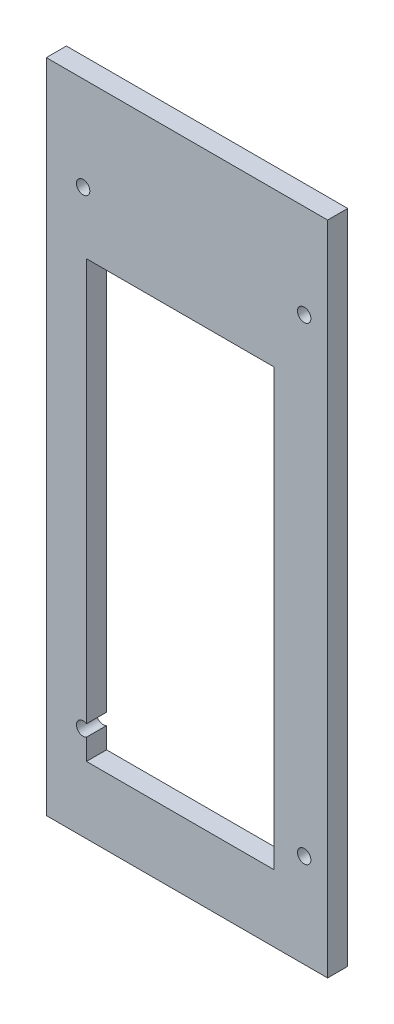
ISO-10303-21;
HEADER;
FILE_DESCRIPTION(('STEP AP214'),'2;1');
FILE_NAME('part.step','',(''),(''),'','','');
FILE_SCHEMA(('AUTOMOTIVE_DESIGN { 1 0 10303 214 1 1 1 1 }'));
ENDSEC;
DATA;
#1=APPLICATION_CONTEXT('core data for automotive mechanical design processes');
#2=APPLICATION_PROTOCOL_DEFINITION('international standard','automotive_design',2000,#1);
#3=PRODUCT_CONTEXT('',#1,'mechanical');
#4=PRODUCT('Part','Part','',(#3));
#5=PRODUCT_RELATED_PRODUCT_CATEGORY('part','',(#4));
#6=PRODUCT_DEFINITION_FORMATION('','',#4);
#7=PRODUCT_DEFINITION_CONTEXT('part definition',#1,'design');
#8=PRODUCT_DEFINITION('design','',#6,#7);
#9=PRODUCT_DEFINITION_SHAPE('','',#8);
#10=(LENGTH_UNIT() NAMED_UNIT(*) SI_UNIT(.MILLI.,.METRE.));
#11=(NAMED_UNIT(*) PLANE_ANGLE_UNIT() SI_UNIT($,.RADIAN.));
#12=(NAMED_UNIT(*) SI_UNIT($,.STERADIAN.) SOLID_ANGLE_UNIT());
#13=UNCERTAINTY_MEASURE_WITH_UNIT(LENGTH_MEASURE(1.E-05),#10,'distance_accuracy_value','');
#14=(GEOMETRIC_REPRESENTATION_CONTEXT(3) GLOBAL_UNCERTAINTY_ASSIGNED_CONTEXT((#13)) GLOBAL_UNIT_ASSIGNED_CONTEXT((#10,
#11,#12)) REPRESENTATION_CONTEXT('',''));
#15=CARTESIAN_POINT('',(0.,0.,0.));
#16=DIRECTION('',(0.,0.,1.));
#17=DIRECTION('',(1.,0.,0.));
#18=AXIS2_PLACEMENT_3D('',#15,#16,#17);
#19=CARTESIAN_POINT('',(6.,0.,3.));
#20=DIRECTION('',(1.,0.,0.));
#21=DIRECTION('',(0.,1.,0.));
#22=AXIS2_PLACEMENT_3D('',#19,#20,#21);
#23=PLANE('',#22);
#24=DIRECTION('',(0.,0.,-1.));
#25=VECTOR('',#24,1.);
#26=CARTESIAN_POINT('',(6.00000000000001,-92.86909632108,5.82842712474619));
#27=LINE('',#26,#25);
#28=CARTESIAN_POINT('',(6.00000000000002,-92.86909632108,3.));
#29=VERTEX_POINT('',#28);
#30=CARTESIAN_POINT('',(6.00000000000001,-92.86909632108,0.));
#31=VERTEX_POINT('',#30);
#32=EDGE_CURVE('E60',#29,#31,#27,.T.);
#33=ORIENTED_EDGE('',*,*,#32,.F.);
#34=DIRECTION('',(0.,-1.,0.));
#35=VECTOR('',#34,1.);
#36=CARTESIAN_POINT('',(6.,0.,3.));
#37=LINE('',#36,#35);
#38=CARTESIAN_POINT('',(6.00000000000001,-96.0030709172956,3.));
#39=VERTEX_POINT('',#38);
#40=EDGE_CURVE('E137',#29,#39,#37,.T.);
#41=ORIENTED_EDGE('',*,*,#40,.T.);
#42=DIRECTION('',(0.,0.,-1.));
#43=VECTOR('',#42,1.);
#44=CARTESIAN_POINT('',(6.00000000000001,-96.0030709172956,3.));
#45=LINE('',#44,#43);
#46=CARTESIAN_POINT('',(6.00000000000001,-96.0030709172956,0.));
#47=VERTEX_POINT('',#46);
#48=EDGE_CURVE('E45',#39,#47,#45,.T.);
#49=ORIENTED_EDGE('',*,*,#48,.T.);
#50=DIRECTION('',(0.,-1.,0.));
#51=VECTOR('',#50,1.);
#52=CARTESIAN_POINT('',(6.,0.,0.));
#53=LINE('',#52,#51);
#54=EDGE_CURVE('E162',#31,#47,#53,.T.);
#55=ORIENTED_EDGE('',*,*,#54,.F.);
#56=EDGE_LOOP('',(#33,#41,#49,#55));
#57=FACE_BOUND('',#56,.T.);
#58=ADVANCED_FACE('F37',(#57),#23,.T.);
#59=CARTESIAN_POINT('',(0.,-31.0030709172956,3.));
#60=DIRECTION('',(0.,-1.,0.));
#61=DIRECTION('',(0.,0.,-1.));
#62=AXIS2_PLACEMENT_3D('',#59,#60,#61);
#63=PLANE('',#62);
#64=DIRECTION('',(0.,0.,1.));
#65=VECTOR('',#64,1.);
#66=CARTESIAN_POINT('',(34.,-31.0030709172956,-65.0307619515564));
#67=LINE('',#66,#65);
#68=CARTESIAN_POINT('',(34.,-31.0030709172956,0.));
#69=VERTEX_POINT('',#68);
#70=CARTESIAN_POINT('',(34.,-31.0030709172956,3.));
#71=VERTEX_POINT('',#70);
#72=EDGE_CURVE('E52',#69,#71,#67,.T.);
#73=ORIENTED_EDGE('',*,*,#72,.T.);
#74=DIRECTION('',(-1.,0.,0.));
#75=VECTOR('',#74,1.);
#76=CARTESIAN_POINT('',(0.,-31.0030709172956,3.));
#77=LINE('',#76,#75);
#78=CARTESIAN_POINT('',(6.,-31.0030709172956,3.));
#79=VERTEX_POINT('',#78);
#80=EDGE_CURVE('E124',#71,#79,#77,.T.);
#81=ORIENTED_EDGE('',*,*,#80,.T.);
#82=DIRECTION('',(0.,0.,-1.));
#83=VECTOR('',#82,1.);
#84=CARTESIAN_POINT('',(6.,-31.0030709172956,3.));
#85=LINE('',#84,#83);
#86=CARTESIAN_POINT('',(6.,-31.0030709172956,0.));
#87=VERTEX_POINT('',#86);
#88=EDGE_CURVE('E167',#79,#87,#85,.T.);
#89=ORIENTED_EDGE('',*,*,#88,.T.);
#90=DIRECTION('',(-1.,0.,0.));
#91=VECTOR('',#90,1.);
#92=CARTESIAN_POINT('',(0.,-31.0030709172956,0.));
#93=LINE('',#92,#91);
#94=EDGE_CURVE('E126',#69,#87,#93,.T.);
#95=ORIENTED_EDGE('',*,*,#94,.F.);
#96=EDGE_LOOP('',(#73,#81,#89,#95));
#97=FACE_BOUND('',#96,.T.);
#98=ADVANCED_FACE('F122',(#97),#63,.T.);
#99=CARTESIAN_POINT('',(0.,-96.0030709172956,3.));
#100=DIRECTION('',(0.,1.,0.));
#101=DIRECTION('',(-1.,0.,0.));
#102=AXIS2_PLACEMENT_3D('',#99,#100,#101);
#103=PLANE('',#102);
#104=DIRECTION('',(0.,0.,1.));
#105=VECTOR('',#104,1.);
#106=CARTESIAN_POINT('',(34.,-96.0030709172956,-65.0307619515564));
#107=LINE('',#106,#105);
#108=CARTESIAN_POINT('',(34.,-96.0030709172956,0.));
#109=VERTEX_POINT('',#108);
#110=CARTESIAN_POINT('',(34.,-96.0030709172956,3.));
#111=VERTEX_POINT('',#110);
#112=EDGE_CURVE('E114',#109,#111,#107,.T.);
#113=ORIENTED_EDGE('',*,*,#112,.F.);
#114=DIRECTION('',(1.,0.,0.));
#115=VECTOR('',#114,1.);
#116=CARTESIAN_POINT('',(0.,-96.0030709172956,0.));
#117=LINE('',#116,#115);
#118=EDGE_CURVE('E159',#47,#109,#117,.T.);
#119=ORIENTED_EDGE('',*,*,#118,.F.);
#120=ORIENTED_EDGE('',*,*,#48,.F.);
#121=DIRECTION('',(1.,0.,0.));
#122=VECTOR('',#121,1.);
#123=CARTESIAN_POINT('',(0.,-96.0030709172956,3.));
#124=LINE('',#123,#122);
#125=EDGE_CURVE('E134',#39,#111,#124,.T.);
#126=ORIENTED_EDGE('',*,*,#125,.T.);
#127=EDGE_LOOP('',(#113,#119,#120,#126));
#128=FACE_BOUND('',#127,.T.);
#129=ADVANCED_FACE('F230',(#128),#103,.T.);
#130=CARTESIAN_POINT('',(0.,-8.00307091729556,3.));
#131=DIRECTION('',(0.,1.,0.));
#132=DIRECTION('',(0.,0.,1.));
#133=AXIS2_PLACEMENT_3D('',#130,#131,#132);
#134=PLANE('',#133);
#135=DIRECTION('',(1.,0.,0.));
#136=VECTOR('',#135,1.);
#137=CARTESIAN_POINT('',(0.,-8.00307091729556,0.));
#138=LINE('',#137,#136);
#139=CARTESIAN_POINT('',(0.,-8.00307091729555,0.));
#140=VERTEX_POINT('',#139);
#141=CARTESIAN_POINT('',(42.,-8.00307091729555,0.));
#142=VERTEX_POINT('',#141);
#143=EDGE_CURVE('E146',#140,#142,#138,.T.);
#144=ORIENTED_EDGE('',*,*,#143,.F.);
#145=DIRECTION('',(0.,0.,-1.));
#146=VECTOR('',#145,1.);
#147=CARTESIAN_POINT('',(0.,-8.00307091729555,3.));
#148=LINE('',#147,#146);
#149=CARTESIAN_POINT('',(0.,-8.00307091729555,3.));
#150=VERTEX_POINT('',#149);
#151=EDGE_CURVE('E169',#150,#140,#148,.T.);
#152=ORIENTED_EDGE('',*,*,#151,.F.);
#153=DIRECTION('',(1.,0.,0.));
#154=VECTOR('',#153,1.);
#155=CARTESIAN_POINT('',(0.,-8.00307091729556,3.));
#156=LINE('',#155,#154);
#157=CARTESIAN_POINT('',(42.,-8.00307091729555,3.));
#158=VERTEX_POINT('',#157);
#159=EDGE_CURVE('E166',#150,#158,#156,.T.);
#160=ORIENTED_EDGE('',*,*,#159,.T.);
#161=DIRECTION('',(0.,0.,-1.));
#162=VECTOR('',#161,1.);
#163=CARTESIAN_POINT('',(42.,-8.00307091729555,3.));
#164=LINE('',#163,#162);
#165=EDGE_CURVE('E145',#158,#142,#164,.T.);
#166=ORIENTED_EDGE('',*,*,#165,.T.);
#167=EDGE_LOOP('',(#144,#152,#160,#166));
#168=FACE_BOUND('',#167,.T.);
#169=ADVANCED_FACE('F39',(#168),#134,.T.);
#170=CARTESIAN_POINT('',(0.,0.,3.));
#171=DIRECTION('',(1.,0.,0.));
#172=DIRECTION('',(0.,0.,-1.));
#173=AXIS2_PLACEMENT_3D('',#170,#171,#172);
#174=PLANE('',#173);
#175=DIRECTION('',(0.,-1.,0.));
#176=VECTOR('',#175,1.);
#177=CARTESIAN_POINT('',(0.,0.,0.));
#178=LINE('',#177,#176);
#179=CARTESIAN_POINT('',(0.,-106.003070917296,0.));
#180=VERTEX_POINT('',#179);
#181=EDGE_CURVE('E149',#140,#180,#178,.T.);
#182=ORIENTED_EDGE('',*,*,#181,.T.);
#183=DIRECTION('',(0.,0.,-1.));
#184=VECTOR('',#183,1.);
#185=CARTESIAN_POINT('',(0.,-106.003070917296,3.));
#186=LINE('',#185,#184);
#187=CARTESIAN_POINT('',(0.,-106.003070917296,3.));
#188=VERTEX_POINT('',#187);
#189=EDGE_CURVE('E175',#188,#180,#186,.T.);
#190=ORIENTED_EDGE('',*,*,#189,.F.);
#191=DIRECTION('',(0.,-1.,0.));
#192=VECTOR('',#191,1.);
#193=CARTESIAN_POINT('',(0.,0.,3.));
#194=LINE('',#193,#192);
#195=EDGE_CURVE('E181',#150,#188,#194,.T.);
#196=ORIENTED_EDGE('',*,*,#195,.F.);
#197=ORIENTED_EDGE('',*,*,#151,.T.);
#198=EDGE_LOOP('',(#182,#190,#196,#197));
#199=FACE_BOUND('',#198,.T.);
#200=ADVANCED_FACE('F179',(#199),#174,.F.);
#201=CARTESIAN_POINT('',(0.,-106.003070917296,3.));
#202=DIRECTION('',(0.,-1.,0.));
#203=DIRECTION('',(0.,0.,-1.));
#204=AXIS2_PLACEMENT_3D('',#201,#202,#203);
#205=PLANE('',#204);
#206=DIRECTION('',(-1.,0.,0.));
#207=VECTOR('',#206,1.);
#208=CARTESIAN_POINT('',(0.,-106.003070917296,0.));
#209=LINE('',#208,#207);
#210=CARTESIAN_POINT('',(42.,-106.003070917296,0.));
#211=VERTEX_POINT('',#210);
#212=EDGE_CURVE('E152',#211,#180,#209,.T.);
#213=ORIENTED_EDGE('',*,*,#212,.F.);
#214=DIRECTION('',(0.,0.,-1.));
#215=VECTOR('',#214,1.);
#216=CARTESIAN_POINT('',(42.,-106.003070917296,3.));
#217=LINE('',#216,#215);
#218=CARTESIAN_POINT('',(42.,-106.003070917296,3.));
#219=VERTEX_POINT('',#218);
#220=EDGE_CURVE('E173',#219,#211,#217,.T.);
#221=ORIENTED_EDGE('',*,*,#220,.F.);
#222=DIRECTION('',(-1.,0.,0.));
#223=VECTOR('',#222,1.);
#224=CARTESIAN_POINT('',(0.,-106.003070917296,3.));
#225=LINE('',#224,#223);
#226=EDGE_CURVE('E140',#219,#188,#225,.T.);
#227=ORIENTED_EDGE('',*,*,#226,.T.);
#228=ORIENTED_EDGE('',*,*,#189,.T.);
#229=EDGE_LOOP('',(#213,#221,#227,#228));
#230=FACE_BOUND('',#229,.T.);
#231=ADVANCED_FACE('F196',(#230),#205,.T.);
#232=CARTESIAN_POINT('',(42.,0.,3.));
#233=DIRECTION('',(1.,0.,0.));
#234=DIRECTION('',(0.,0.,-1.));
#235=AXIS2_PLACEMENT_3D('',#232,#233,#234);
#236=PLANE('',#235);
#237=DIRECTION('',(0.,-1.,0.));
#238=VECTOR('',#237,1.);
#239=CARTESIAN_POINT('',(42.,0.,0.));
#240=LINE('',#239,#238);
#241=EDGE_CURVE('E155',#142,#211,#240,.T.);
#242=ORIENTED_EDGE('',*,*,#241,.F.);
#243=ORIENTED_EDGE('',*,*,#165,.F.);
#244=DIRECTION('',(0.,-1.,0.));
#245=VECTOR('',#244,1.);
#246=CARTESIAN_POINT('',(42.,0.,3.));
#247=LINE('',#246,#245);
#248=EDGE_CURVE('E135',#158,#219,#247,.T.);
#249=ORIENTED_EDGE('',*,*,#248,.T.);
#250=ORIENTED_EDGE('',*,*,#220,.T.);
#251=EDGE_LOOP('',(#242,#243,#249,#250));
#252=FACE_BOUND('',#251,.T.);
#253=ADVANCED_FACE('F192',(#252),#236,.T.);
#254=DIRECTION('',(0.,0.,-1.));
#255=VECTOR('',#254,1.);
#256=CARTESIAN_POINT('',(6.00000000000001,-91.1370455135111,5.82842712474619));
#257=LINE('',#256,#255);
#258=CARTESIAN_POINT('',(6.00000000000002,-91.1370455135111,0.));
#259=VERTEX_POINT('',#258);
#260=CARTESIAN_POINT('',(6.00000000000002,-91.1370455135111,3.));
#261=VERTEX_POINT('',#260);
#262=EDGE_CURVE('E202',#259,#261,#257,.F.);
#263=ORIENTED_EDGE('',*,*,#262,.F.);
#264=EDGE_CURVE('E163',#87,#259,#53,.T.);
#265=ORIENTED_EDGE('',*,*,#264,.F.);
#266=ORIENTED_EDGE('',*,*,#88,.F.);
#267=EDGE_CURVE('E133',#79,#261,#37,.T.);
#268=ORIENTED_EDGE('',*,*,#267,.T.);
#269=EDGE_LOOP('',(#263,#265,#266,#268));
#270=FACE_BOUND('',#269,.T.);
#271=ADVANCED_FACE('F239',(#270),#23,.T.);
#272=CARTESIAN_POINT('',(0.,0.,3.));
#273=DIRECTION('',(0.,0.,1.));
#274=DIRECTION('',(1.,0.,0.));
#275=AXIS2_PLACEMENT_3D('',#272,#273,#274);
#276=PLANE('',#275);
#277=CARTESIAN_POINT('',(38.5,-92.0030709172956,3.));
#278=DIRECTION('',(0.,0.,1.));
#279=DIRECTION('',(1.,0.,0.));
#280=AXIS2_PLACEMENT_3D('',#277,#278,#279);
#281=CIRCLE('',#280,0.999999999999998);
#282=CARTESIAN_POINT('',(37.5,-92.0030709172956,3.));
#283=VERTEX_POINT('',#282);
#284=EDGE_CURVE('E211',#283,#283,#281,.F.);
#285=ORIENTED_EDGE('',*,*,#284,.T.);
#286=EDGE_LOOP('',(#285));
#287=FACE_BOUND('',#286,.T.);
#288=CARTESIAN_POINT('',(5.50000000000003,-92.0030709172955,3.));
#289=DIRECTION('',(0.,0.,1.));
#290=DIRECTION('',(1.,0.,0.));
#291=AXIS2_PLACEMENT_3D('',#288,#289,#290);
#292=CIRCLE('',#291,1.);
#293=EDGE_CURVE('E214',#29,#261,#292,.F.);
#294=ORIENTED_EDGE('',*,*,#293,.T.);
#295=ORIENTED_EDGE('',*,*,#267,.F.);
#296=ORIENTED_EDGE('',*,*,#80,.F.);
#297=DIRECTION('',(0.,-1.,0.));
#298=VECTOR('',#297,1.);
#299=CARTESIAN_POINT('',(34.,-31.0030709172956,3.));
#300=LINE('',#299,#298);
#301=EDGE_CURVE('E111',#71,#111,#300,.T.);
#302=ORIENTED_EDGE('',*,*,#301,.T.);
#303=ORIENTED_EDGE('',*,*,#125,.F.);
#304=ORIENTED_EDGE('',*,*,#40,.F.);
#305=EDGE_LOOP('',(#294,#295,#296,#302,#303,#304));
#306=FACE_BOUND('',#305,.T.);
#307=CARTESIAN_POINT('',(5.50000000000003,-22.0030709172956,3.));
#308=DIRECTION('',(0.,0.,1.));
#309=DIRECTION('',(1.,0.,0.));
#310=AXIS2_PLACEMENT_3D('',#307,#308,#309);
#311=CIRCLE('',#310,1.);
#312=CARTESIAN_POINT('',(4.50000000000002,-22.0030709172956,3.));
#313=VERTEX_POINT('',#312);
#314=EDGE_CURVE('E210',#313,#313,#311,.F.);
#315=ORIENTED_EDGE('',*,*,#314,.T.);
#316=EDGE_LOOP('',(#315));
#317=FACE_BOUND('',#316,.T.);
#318=CARTESIAN_POINT('',(38.5,-22.0030709172956,3.));
#319=DIRECTION('',(0.,0.,1.));
#320=DIRECTION('',(1.,0.,0.));
#321=AXIS2_PLACEMENT_3D('',#318,#319,#320);
#322=CIRCLE('',#321,0.999999999999998);
#323=CARTESIAN_POINT('',(37.5,-22.0030709172956,3.));
#324=VERTEX_POINT('',#323);
#325=EDGE_CURVE('E204',#324,#324,#322,.F.);
#326=ORIENTED_EDGE('',*,*,#325,.T.);
#327=EDGE_LOOP('',(#326));
#328=FACE_BOUND('',#327,.T.);
#329=ORIENTED_EDGE('',*,*,#159,.F.);
#330=ORIENTED_EDGE('',*,*,#195,.T.);
#331=ORIENTED_EDGE('',*,*,#226,.F.);
#332=ORIENTED_EDGE('',*,*,#248,.F.);
#333=EDGE_LOOP('',(#329,#330,#331,#332));
#334=FACE_BOUND('',#333,.T.);
#335=ADVANCED_FACE('F130',(#287,#306,#317,#328,#334),#276,.T.);
#336=CARTESIAN_POINT('',(0.,0.,0.));
#337=DIRECTION('',(0.,0.,1.));
#338=DIRECTION('',(1.,0.,0.));
#339=AXIS2_PLACEMENT_3D('',#336,#337,#338);
#340=PLANE('',#339);
#341=ORIENTED_EDGE('',*,*,#118,.T.);
#342=DIRECTION('',(0.,1.,0.));
#343=VECTOR('',#342,1.);
#344=CARTESIAN_POINT('',(34.,-31.0030709172956,0.));
#345=LINE('',#344,#343);
#346=EDGE_CURVE('E218',#109,#69,#345,.T.);
#347=ORIENTED_EDGE('',*,*,#346,.T.);
#348=ORIENTED_EDGE('',*,*,#94,.T.);
#349=ORIENTED_EDGE('',*,*,#264,.T.);
#350=CARTESIAN_POINT('',(5.50000000000003,-92.0030709172955,0.));
#351=DIRECTION('',(0.,0.,1.));
#352=DIRECTION('',(1.,0.,0.));
#353=AXIS2_PLACEMENT_3D('',#350,#351,#352);
#354=CIRCLE('',#353,1.);
#355=EDGE_CURVE('E11',#259,#31,#354,.T.);
#356=ORIENTED_EDGE('',*,*,#355,.T.);
#357=ORIENTED_EDGE('',*,*,#54,.T.);
#358=EDGE_LOOP('',(#341,#347,#348,#349,#356,#357));
#359=FACE_BOUND('',#358,.T.);
#360=CARTESIAN_POINT('',(38.5,-92.0030709172956,0.));
#361=DIRECTION('',(0.,0.,-1.));
#362=DIRECTION('',(1.,0.,0.));
#363=AXIS2_PLACEMENT_3D('',#360,#361,#362);
#364=CIRCLE('',#363,0.999999999999998);
#365=CARTESIAN_POINT('',(37.5,-92.0030709172956,0.));
#366=VERTEX_POINT('',#365);
#367=EDGE_CURVE('E215',#366,#366,#364,.T.);
#368=ORIENTED_EDGE('',*,*,#367,.F.);
#369=EDGE_LOOP('',(#368));
#370=FACE_BOUND('',#369,.T.);
#371=CARTESIAN_POINT('',(5.50000000000003,-22.0030709172956,0.));
#372=DIRECTION('',(0.,0.,-1.));
#373=DIRECTION('',(1.,0.,0.));
#374=AXIS2_PLACEMENT_3D('',#371,#372,#373);
#375=CIRCLE('',#374,1.);
#376=CARTESIAN_POINT('',(4.50000000000002,-22.0030709172956,0.));
#377=VERTEX_POINT('',#376);
#378=EDGE_CURVE('E220',#377,#377,#375,.T.);
#379=ORIENTED_EDGE('',*,*,#378,.F.);
#380=EDGE_LOOP('',(#379));
#381=FACE_BOUND('',#380,.T.);
#382=CARTESIAN_POINT('',(38.5,-22.0030709172956,0.));
#383=DIRECTION('',(0.,0.,-1.));
#384=DIRECTION('',(-1.,0.,0.));
#385=AXIS2_PLACEMENT_3D('',#382,#383,#384);
#386=CIRCLE('',#385,0.999999999999998);
#387=CARTESIAN_POINT('',(37.5,-22.0030709172956,0.));
#388=VERTEX_POINT('',#387);
#389=EDGE_CURVE('E207',#388,#388,#386,.T.);
#390=ORIENTED_EDGE('',*,*,#389,.F.);
#391=EDGE_LOOP('',(#390));
#392=FACE_BOUND('',#391,.T.);
#393=ORIENTED_EDGE('',*,*,#143,.T.);
#394=ORIENTED_EDGE('',*,*,#241,.T.);
#395=ORIENTED_EDGE('',*,*,#212,.T.);
#396=ORIENTED_EDGE('',*,*,#181,.F.);
#397=EDGE_LOOP('',(#393,#394,#395,#396));
#398=FACE_BOUND('',#397,.T.);
#399=ADVANCED_FACE('F187',(#359,#370,#381,#392,#398),#340,.F.);
#400=CARTESIAN_POINT('',(38.5,-22.0030709172956,5.82842712474619));
#401=DIRECTION('',(0.,0.,-1.));
#402=DIRECTION('',(-1.,0.,0.));
#403=AXIS2_PLACEMENT_3D('',#400,#401,#402);
#404=CYLINDRICAL_SURFACE('',#403,0.999999999999998);
#405=CARTESIAN_POINT('',(37.5,-22.0030709172956,0.));
#406=CARTESIAN_POINT('',(37.5,-22.0030709172956,0.03125));
#407=CARTESIAN_POINT('',(37.5,-22.0030709172956,0.0625000000000001));
#408=CARTESIAN_POINT('',(37.5,-22.0030709172956,0.125));
#409=CARTESIAN_POINT('',(37.5,-22.0030709172956,0.15625));
#410=CARTESIAN_POINT('',(37.5,-22.0030709172956,0.21875));
#411=CARTESIAN_POINT('',(37.5,-22.0030709172956,0.25));
#412=CARTESIAN_POINT('',(37.5,-22.0030709172956,0.3125));
#413=CARTESIAN_POINT('',(37.5,-22.0030709172956,0.34375));
#414=CARTESIAN_POINT('',(37.5,-22.0030709172956,0.40625));
#415=CARTESIAN_POINT('',(37.5,-22.0030709172956,0.4375));
#416=CARTESIAN_POINT('',(37.5,-22.0030709172956,0.5));
#417=CARTESIAN_POINT('',(37.5,-22.0030709172956,0.53125));
#418=CARTESIAN_POINT('',(37.5,-22.0030709172956,0.59375));
#419=CARTESIAN_POINT('',(37.5,-22.0030709172956,0.625));
#420=CARTESIAN_POINT('',(37.5,-22.0030709172956,0.6875));
#421=CARTESIAN_POINT('',(37.5,-22.0030709172956,0.71875));
#422=CARTESIAN_POINT('',(37.5,-22.0030709172956,0.78125));
#423=CARTESIAN_POINT('',(37.5,-22.0030709172956,0.8125));
#424=CARTESIAN_POINT('',(37.5,-22.0030709172956,0.875));
#425=CARTESIAN_POINT('',(37.5,-22.0030709172956,0.90625));
#426=CARTESIAN_POINT('',(37.5,-22.0030709172956,0.96875));
#427=CARTESIAN_POINT('',(37.5,-22.0030709172956,1.));
#428=CARTESIAN_POINT('',(37.5,-22.0030709172956,1.0625));
#429=CARTESIAN_POINT('',(37.5,-22.0030709172956,1.09375));
#430=CARTESIAN_POINT('',(37.5,-22.0030709172956,1.15625));
#431=CARTESIAN_POINT('',(37.5,-22.0030709172956,1.1875));
#432=CARTESIAN_POINT('',(37.5,-22.0030709172956,1.25));
#433=CARTESIAN_POINT('',(37.5,-22.0030709172956,1.28125));
#434=CARTESIAN_POINT('',(37.5,-22.0030709172956,1.34375));
#435=CARTESIAN_POINT('',(37.5,-22.0030709172956,1.375));
#436=CARTESIAN_POINT('',(37.5,-22.0030709172956,1.4375));
#437=CARTESIAN_POINT('',(37.5,-22.0030709172956,1.46875));
#438=CARTESIAN_POINT('',(37.5,-22.0030709172956,1.53125));
#439=CARTESIAN_POINT('',(37.5,-22.0030709172956,1.5625));
#440=CARTESIAN_POINT('',(37.5,-22.0030709172956,1.625));
#441=CARTESIAN_POINT('',(37.5,-22.0030709172956,1.65625));
#442=CARTESIAN_POINT('',(37.5,-22.0030709172956,1.71875));
#443=CARTESIAN_POINT('',(37.5,-22.0030709172956,1.75));
#444=CARTESIAN_POINT('',(37.5,-22.0030709172956,1.8125));
#445=CARTESIAN_POINT('',(37.5,-22.0030709172956,1.84375));
#446=CARTESIAN_POINT('',(37.5,-22.0030709172956,1.90625));
#447=CARTESIAN_POINT('',(37.5,-22.0030709172956,1.9375));
#448=CARTESIAN_POINT('',(37.5,-22.0030709172956,2.));
#449=CARTESIAN_POINT('',(37.5,-22.0030709172956,2.03125));
#450=CARTESIAN_POINT('',(37.5,-22.0030709172956,2.09375));
#451=CARTESIAN_POINT('',(37.5,-22.0030709172956,2.125));
#452=CARTESIAN_POINT('',(37.5,-22.0030709172956,2.1875));
#453=CARTESIAN_POINT('',(37.5,-22.0030709172956,2.21875));
#454=CARTESIAN_POINT('',(37.5,-22.0030709172956,2.28125));
#455=CARTESIAN_POINT('',(37.5,-22.0030709172956,2.3125));
#456=CARTESIAN_POINT('',(37.5,-22.0030709172956,2.375));
#457=CARTESIAN_POINT('',(37.5,-22.0030709172956,2.40625));
#458=CARTESIAN_POINT('',(37.5,-22.0030709172956,2.46875));
#459=CARTESIAN_POINT('',(37.5,-22.0030709172956,2.5));
#460=CARTESIAN_POINT('',(37.5,-22.0030709172956,2.5625));
#461=CARTESIAN_POINT('',(37.5,-22.0030709172956,2.59375));
#462=CARTESIAN_POINT('',(37.5,-22.0030709172956,2.65625));
#463=CARTESIAN_POINT('',(37.5,-22.0030709172956,2.6875));
#464=CARTESIAN_POINT('',(37.5,-22.0030709172956,2.75));
#465=CARTESIAN_POINT('',(37.5,-22.0030709172956,2.78125));
#466=CARTESIAN_POINT('',(37.5,-22.0030709172956,2.84375));
#467=CARTESIAN_POINT('',(37.5,-22.0030709172956,2.875));
#468=CARTESIAN_POINT('',(37.5,-22.0030709172956,2.9375));
#469=CARTESIAN_POINT('',(37.5,-22.0030709172956,2.96875));
#470=CARTESIAN_POINT('',(37.5,-22.0030709172956,3.));
#471=B_SPLINE_CURVE_WITH_KNOTS('',3,(#405,#406,#407,#408,#409,#410,#411,#412,#413,#414,#415,
#416,#417,#418,#419,#420,#421,#422,#423,#424,#425,#426,#427,#428,#429,#430,#431,#432,#433,#434,
#435,#436,#437,#438,#439,#440,#441,#442,#443,#444,#445,#446,#447,#448,#449,#450,#451,#452,#453,
#454,#455,#456,#457,#458,#459,#460,#461,#462,#463,#464,#465,#466,#467,#468,#469,#470),
.UNSPECIFIED.,.F.,.F.,(4,2,2,2,2,2,2,2,2,2,2,2,2,2,2,2,2,2,2,2,2,2,2,2,2,2,2,2,2,2,2,2,4),(0.,
0.0937500000000001,0.1875,0.28125,0.375,0.46875,0.5625,0.65625,0.75,0.84375,0.9375,1.03125,
1.125,1.21875,1.3125,1.40625,1.5,1.59375,1.6875,1.78125,1.875,1.96875,2.0625,2.15625,2.25,
2.34375,2.4375,2.53125,2.625,2.71875,2.8125,2.90625,3.),.UNSPECIFIED.);
#472=EDGE_CURVE('BSEAM292',#388,#324,#471,.T.);
#473=ORIENTED_EDGE('',*,*,#389,.T.);
#474=ORIENTED_EDGE('',*,*,#325,.F.);
#475=ORIENTED_EDGE('',*,*,#472,.T.);
#476=ORIENTED_EDGE('',*,*,#472,.F.);
#477=EDGE_LOOP('',(#473,#475,#474,#476));
#478=FACE_BOUND('',#477,.T.);
#479=ADVANCED_FACE('F292',(#478),#404,.F.);
#480=CARTESIAN_POINT('',(5.50000000000003,-22.0030709172956,5.82842712474619));
#481=DIRECTION('',(0.,0.,-1.));
#482=DIRECTION('',(-1.,0.,0.));
#483=AXIS2_PLACEMENT_3D('',#480,#481,#482);
#484=CYLINDRICAL_SURFACE('',#483,1.);
#485=CARTESIAN_POINT('',(4.50000000000002,-22.0030709172956,0.));
#486=CARTESIAN_POINT('',(4.50000000000002,-22.0030709172956,0.03125));
#487=CARTESIAN_POINT('',(4.50000000000002,-22.0030709172956,0.0625000000000001));
#488=CARTESIAN_POINT('',(4.50000000000002,-22.0030709172956,0.125));
#489=CARTESIAN_POINT('',(4.50000000000002,-22.0030709172956,0.15625));
#490=CARTESIAN_POINT('',(4.50000000000002,-22.0030709172956,0.21875));
#491=CARTESIAN_POINT('',(4.50000000000002,-22.0030709172956,0.25));
#492=CARTESIAN_POINT('',(4.50000000000002,-22.0030709172956,0.3125));
#493=CARTESIAN_POINT('',(4.50000000000002,-22.0030709172956,0.34375));
#494=CARTESIAN_POINT('',(4.50000000000002,-22.0030709172956,0.40625));
#495=CARTESIAN_POINT('',(4.50000000000002,-22.0030709172956,0.4375));
#496=CARTESIAN_POINT('',(4.50000000000002,-22.0030709172956,0.5));
#497=CARTESIAN_POINT('',(4.50000000000002,-22.0030709172956,0.53125));
#498=CARTESIAN_POINT('',(4.50000000000002,-22.0030709172956,0.59375));
#499=CARTESIAN_POINT('',(4.50000000000002,-22.0030709172956,0.625));
#500=CARTESIAN_POINT('',(4.50000000000002,-22.0030709172956,0.6875));
#501=CARTESIAN_POINT('',(4.50000000000002,-22.0030709172956,0.71875));
#502=CARTESIAN_POINT('',(4.50000000000002,-22.0030709172956,0.78125));
#503=CARTESIAN_POINT('',(4.50000000000002,-22.0030709172956,0.8125));
#504=CARTESIAN_POINT('',(4.50000000000002,-22.0030709172956,0.875));
#505=CARTESIAN_POINT('',(4.50000000000002,-22.0030709172956,0.90625));
#506=CARTESIAN_POINT('',(4.50000000000002,-22.0030709172956,0.96875));
#507=CARTESIAN_POINT('',(4.50000000000002,-22.0030709172956,1.));
#508=CARTESIAN_POINT('',(4.50000000000002,-22.0030709172956,1.0625));
#509=CARTESIAN_POINT('',(4.50000000000002,-22.0030709172956,1.09375));
#510=CARTESIAN_POINT('',(4.50000000000002,-22.0030709172956,1.15625));
#511=CARTESIAN_POINT('',(4.50000000000002,-22.0030709172956,1.1875));
#512=CARTESIAN_POINT('',(4.50000000000002,-22.0030709172956,1.25));
#513=CARTESIAN_POINT('',(4.50000000000002,-22.0030709172956,1.28125));
#514=CARTESIAN_POINT('',(4.50000000000002,-22.0030709172956,1.34375));
#515=CARTESIAN_POINT('',(4.50000000000002,-22.0030709172956,1.375));
#516=CARTESIAN_POINT('',(4.50000000000002,-22.0030709172956,1.4375));
#517=CARTESIAN_POINT('',(4.50000000000002,-22.0030709172956,1.46875));
#518=CARTESIAN_POINT('',(4.50000000000002,-22.0030709172956,1.53125));
#519=CARTESIAN_POINT('',(4.50000000000002,-22.0030709172956,1.5625));
#520=CARTESIAN_POINT('',(4.50000000000002,-22.0030709172956,1.625));
#521=CARTESIAN_POINT('',(4.50000000000002,-22.0030709172956,1.65625));
#522=CARTESIAN_POINT('',(4.50000000000002,-22.0030709172956,1.71875));
#523=CARTESIAN_POINT('',(4.50000000000002,-22.0030709172956,1.75));
#524=CARTESIAN_POINT('',(4.50000000000002,-22.0030709172956,1.8125));
#525=CARTESIAN_POINT('',(4.50000000000002,-22.0030709172956,1.84375));
#526=CARTESIAN_POINT('',(4.50000000000002,-22.0030709172956,1.90625));
#527=CARTESIAN_POINT('',(4.50000000000002,-22.0030709172956,1.9375));
#528=CARTESIAN_POINT('',(4.50000000000002,-22.0030709172956,2.));
#529=CARTESIAN_POINT('',(4.50000000000002,-22.0030709172956,2.03125));
#530=CARTESIAN_POINT('',(4.50000000000002,-22.0030709172956,2.09375));
#531=CARTESIAN_POINT('',(4.50000000000002,-22.0030709172956,2.125));
#532=CARTESIAN_POINT('',(4.50000000000002,-22.0030709172956,2.1875));
#533=CARTESIAN_POINT('',(4.50000000000002,-22.0030709172956,2.21875));
#534=CARTESIAN_POINT('',(4.50000000000002,-22.0030709172956,2.28125));
#535=CARTESIAN_POINT('',(4.50000000000002,-22.0030709172956,2.3125));
#536=CARTESIAN_POINT('',(4.50000000000002,-22.0030709172956,2.375));
#537=CARTESIAN_POINT('',(4.50000000000002,-22.0030709172956,2.40625));
#538=CARTESIAN_POINT('',(4.50000000000002,-22.0030709172956,2.46875));
#539=CARTESIAN_POINT('',(4.50000000000002,-22.0030709172956,2.5));
#540=CARTESIAN_POINT('',(4.50000000000002,-22.0030709172956,2.5625));
#541=CARTESIAN_POINT('',(4.50000000000002,-22.0030709172956,2.59375));
#542=CARTESIAN_POINT('',(4.50000000000002,-22.0030709172956,2.65625));
#543=CARTESIAN_POINT('',(4.50000000000002,-22.0030709172956,2.6875));
#544=CARTESIAN_POINT('',(4.50000000000002,-22.0030709172956,2.75));
#545=CARTESIAN_POINT('',(4.50000000000002,-22.0030709172956,2.78125));
#546=CARTESIAN_POINT('',(4.50000000000002,-22.0030709172956,2.84375));
#547=CARTESIAN_POINT('',(4.50000000000002,-22.0030709172956,2.875));
#548=CARTESIAN_POINT('',(4.50000000000002,-22.0030709172956,2.9375));
#549=CARTESIAN_POINT('',(4.50000000000002,-22.0030709172956,2.96875));
#550=CARTESIAN_POINT('',(4.50000000000002,-22.0030709172956,3.));
#551=B_SPLINE_CURVE_WITH_KNOTS('',3,(#485,#486,#487,#488,#489,#490,#491,#492,#493,#494,#495,
#496,#497,#498,#499,#500,#501,#502,#503,#504,#505,#506,#507,#508,#509,#510,#511,#512,#513,#514,
#515,#516,#517,#518,#519,#520,#521,#522,#523,#524,#525,#526,#527,#528,#529,#530,#531,#532,#533,
#534,#535,#536,#537,#538,#539,#540,#541,#542,#543,#544,#545,#546,#547,#548,#549,#550),
.UNSPECIFIED.,.F.,.F.,(4,2,2,2,2,2,2,2,2,2,2,2,2,2,2,2,2,2,2,2,2,2,2,2,2,2,2,2,2,2,2,2,4),(0.,
0.0937500000000001,0.1875,0.28125,0.375,0.46875,0.5625,0.65625,0.75,0.84375,0.9375,1.03125,
1.125,1.21875,1.3125,1.40625,1.5,1.59375,1.6875,1.78125,1.875,1.96875,2.0625,2.15625,2.25,
2.34375,2.4375,2.53125,2.625,2.71875,2.8125,2.90625,3.),.UNSPECIFIED.);
#552=EDGE_CURVE('BSEAM315',#377,#313,#551,.T.);
#553=ORIENTED_EDGE('',*,*,#378,.T.);
#554=ORIENTED_EDGE('',*,*,#314,.F.);
#555=ORIENTED_EDGE('',*,*,#552,.T.);
#556=ORIENTED_EDGE('',*,*,#552,.F.);
#557=EDGE_LOOP('',(#553,#555,#554,#556));
#558=FACE_BOUND('',#557,.T.);
#559=ADVANCED_FACE('F315',(#558),#484,.F.);
#560=CARTESIAN_POINT('',(5.50000000000003,-92.0030709172955,5.82842712474619));
#561=DIRECTION('',(0.,0.,-1.));
#562=DIRECTION('',(-1.,0.,0.));
#563=AXIS2_PLACEMENT_3D('',#560,#561,#562);
#564=CYLINDRICAL_SURFACE('',#563,1.);
#565=ORIENTED_EDGE('',*,*,#32,.T.);
#566=ORIENTED_EDGE('',*,*,#355,.F.);
#567=ORIENTED_EDGE('',*,*,#262,.T.);
#568=ORIENTED_EDGE('',*,*,#293,.F.);
#569=EDGE_LOOP('',(#565,#566,#567,#568));
#570=FACE_BOUND('',#569,.T.);
#571=ADVANCED_FACE('F237',(#570),#564,.F.);
#572=CARTESIAN_POINT('',(38.5,-92.0030709172956,5.82842712474619));
#573=DIRECTION('',(0.,0.,-1.));
#574=DIRECTION('',(-1.,0.,0.));
#575=AXIS2_PLACEMENT_3D('',#572,#573,#574);
#576=CYLINDRICAL_SURFACE('',#575,0.999999999999998);
#577=CARTESIAN_POINT('',(37.5,-92.0030709172956,0.));
#578=CARTESIAN_POINT('',(37.5,-92.0030709172956,0.03125));
#579=CARTESIAN_POINT('',(37.5,-92.0030709172956,0.0625000000000001));
#580=CARTESIAN_POINT('',(37.5,-92.0030709172956,0.125));
#581=CARTESIAN_POINT('',(37.5,-92.0030709172956,0.15625));
#582=CARTESIAN_POINT('',(37.5,-92.0030709172956,0.21875));
#583=CARTESIAN_POINT('',(37.5,-92.0030709172956,0.25));
#584=CARTESIAN_POINT('',(37.5,-92.0030709172956,0.3125));
#585=CARTESIAN_POINT('',(37.5,-92.0030709172956,0.34375));
#586=CARTESIAN_POINT('',(37.5,-92.0030709172956,0.40625));
#587=CARTESIAN_POINT('',(37.5,-92.0030709172956,0.4375));
#588=CARTESIAN_POINT('',(37.5,-92.0030709172956,0.5));
#589=CARTESIAN_POINT('',(37.5,-92.0030709172956,0.53125));
#590=CARTESIAN_POINT('',(37.5,-92.0030709172956,0.59375));
#591=CARTESIAN_POINT('',(37.5,-92.0030709172956,0.625));
#592=CARTESIAN_POINT('',(37.5,-92.0030709172956,0.6875));
#593=CARTESIAN_POINT('',(37.5,-92.0030709172956,0.71875));
#594=CARTESIAN_POINT('',(37.5,-92.0030709172956,0.78125));
#595=CARTESIAN_POINT('',(37.5,-92.0030709172956,0.8125));
#596=CARTESIAN_POINT('',(37.5,-92.0030709172956,0.875));
#597=CARTESIAN_POINT('',(37.5,-92.0030709172956,0.90625));
#598=CARTESIAN_POINT('',(37.5,-92.0030709172956,0.96875));
#599=CARTESIAN_POINT('',(37.5,-92.0030709172956,1.));
#600=CARTESIAN_POINT('',(37.5,-92.0030709172956,1.0625));
#601=CARTESIAN_POINT('',(37.5,-92.0030709172956,1.09375));
#602=CARTESIAN_POINT('',(37.5,-92.0030709172956,1.15625));
#603=CARTESIAN_POINT('',(37.5,-92.0030709172956,1.1875));
#604=CARTESIAN_POINT('',(37.5,-92.0030709172956,1.25));
#605=CARTESIAN_POINT('',(37.5,-92.0030709172956,1.28125));
#606=CARTESIAN_POINT('',(37.5,-92.0030709172956,1.34375));
#607=CARTESIAN_POINT('',(37.5,-92.0030709172956,1.375));
#608=CARTESIAN_POINT('',(37.5,-92.0030709172956,1.4375));
#609=CARTESIAN_POINT('',(37.5,-92.0030709172956,1.46875));
#610=CARTESIAN_POINT('',(37.5,-92.0030709172956,1.53125));
#611=CARTESIAN_POINT('',(37.5,-92.0030709172956,1.5625));
#612=CARTESIAN_POINT('',(37.5,-92.0030709172956,1.625));
#613=CARTESIAN_POINT('',(37.5,-92.0030709172956,1.65625));
#614=CARTESIAN_POINT('',(37.5,-92.0030709172956,1.71875));
#615=CARTESIAN_POINT('',(37.5,-92.0030709172956,1.75));
#616=CARTESIAN_POINT('',(37.5,-92.0030709172956,1.8125));
#617=CARTESIAN_POINT('',(37.5,-92.0030709172956,1.84375));
#618=CARTESIAN_POINT('',(37.5,-92.0030709172956,1.90625));
#619=CARTESIAN_POINT('',(37.5,-92.0030709172956,1.9375));
#620=CARTESIAN_POINT('',(37.5,-92.0030709172956,2.));
#621=CARTESIAN_POINT('',(37.5,-92.0030709172956,2.03125));
#622=CARTESIAN_POINT('',(37.5,-92.0030709172956,2.09375));
#623=CARTESIAN_POINT('',(37.5,-92.0030709172956,2.125));
#624=CARTESIAN_POINT('',(37.5,-92.0030709172956,2.1875));
#625=CARTESIAN_POINT('',(37.5,-92.0030709172956,2.21875));
#626=CARTESIAN_POINT('',(37.5,-92.0030709172956,2.28125));
#627=CARTESIAN_POINT('',(37.5,-92.0030709172956,2.3125));
#628=CARTESIAN_POINT('',(37.5,-92.0030709172956,2.375));
#629=CARTESIAN_POINT('',(37.5,-92.0030709172956,2.40625));
#630=CARTESIAN_POINT('',(37.5,-92.0030709172956,2.46875));
#631=CARTESIAN_POINT('',(37.5,-92.0030709172956,2.5));
#632=CARTESIAN_POINT('',(37.5,-92.0030709172956,2.5625));
#633=CARTESIAN_POINT('',(37.5,-92.0030709172956,2.59375));
#634=CARTESIAN_POINT('',(37.5,-92.0030709172956,2.65625));
#635=CARTESIAN_POINT('',(37.5,-92.0030709172956,2.6875));
#636=CARTESIAN_POINT('',(37.5,-92.0030709172956,2.75));
#637=CARTESIAN_POINT('',(37.5,-92.0030709172956,2.78125));
#638=CARTESIAN_POINT('',(37.5,-92.0030709172956,2.84375));
#639=CARTESIAN_POINT('',(37.5,-92.0030709172956,2.875));
#640=CARTESIAN_POINT('',(37.5,-92.0030709172956,2.9375));
#641=CARTESIAN_POINT('',(37.5,-92.0030709172956,2.96875));
#642=CARTESIAN_POINT('',(37.5,-92.0030709172956,3.));
#643=B_SPLINE_CURVE_WITH_KNOTS('',3,(#577,#578,#579,#580,#581,#582,#583,#584,#585,#586,#587,
#588,#589,#590,#591,#592,#593,#594,#595,#596,#597,#598,#599,#600,#601,#602,#603,#604,#605,#606,
#607,#608,#609,#610,#611,#612,#613,#614,#615,#616,#617,#618,#619,#620,#621,#622,#623,#624,#625,
#626,#627,#628,#629,#630,#631,#632,#633,#634,#635,#636,#637,#638,#639,#640,#641,#642),
.UNSPECIFIED.,.F.,.F.,(4,2,2,2,2,2,2,2,2,2,2,2,2,2,2,2,2,2,2,2,2,2,2,2,2,2,2,2,2,2,2,2,4),(0.,
0.0937500000000001,0.1875,0.28125,0.375,0.46875,0.5625,0.65625,0.75,0.84375,0.9375,1.03125,
1.125,1.21875,1.3125,1.40625,1.5,1.59375,1.6875,1.78125,1.875,1.96875,2.0625,2.15625,2.25,
2.34375,2.4375,2.53125,2.625,2.71875,2.8125,2.90625,3.),.UNSPECIFIED.);
#644=EDGE_CURVE('BSEAM301',#366,#283,#643,.T.);
#645=ORIENTED_EDGE('',*,*,#367,.T.);
#646=ORIENTED_EDGE('',*,*,#284,.F.);
#647=ORIENTED_EDGE('',*,*,#644,.T.);
#648=ORIENTED_EDGE('',*,*,#644,.F.);
#649=EDGE_LOOP('',(#645,#647,#646,#648));
#650=FACE_BOUND('',#649,.T.);
#651=ADVANCED_FACE('F301',(#650),#576,.F.);
#652=CARTESIAN_POINT('',(34.,-31.0030709172956,-65.0307619515564));
#653=DIRECTION('',(-1.,0.,0.));
#654=DIRECTION('',(0.,-1.,0.));
#655=AXIS2_PLACEMENT_3D('',#652,#653,#654);
#656=PLANE('',#655);
#657=ORIENTED_EDGE('',*,*,#346,.F.);
#658=ORIENTED_EDGE('',*,*,#112,.T.);
#659=ORIENTED_EDGE('',*,*,#301,.F.);
#660=ORIENTED_EDGE('',*,*,#72,.F.);
#661=EDGE_LOOP('',(#657,#658,#659,#660));
#662=FACE_BOUND('',#661,.T.);
#663=ADVANCED_FACE('F112',(#662),#656,.T.);
#664=CLOSED_SHELL('',(#58,#98,#129,#169,#200,#231,#253,#271,#335,#399,#479,#559,#571,#651,#663));
#665=MANIFOLD_SOLID_BREP('B2',#664);
#666=ADVANCED_BREP_SHAPE_REPRESENTATION('',(#18,#665),#14);
#667=SHAPE_DEFINITION_REPRESENTATION(#9,#666);
ENDSEC;
END-ISO-10303-21;
